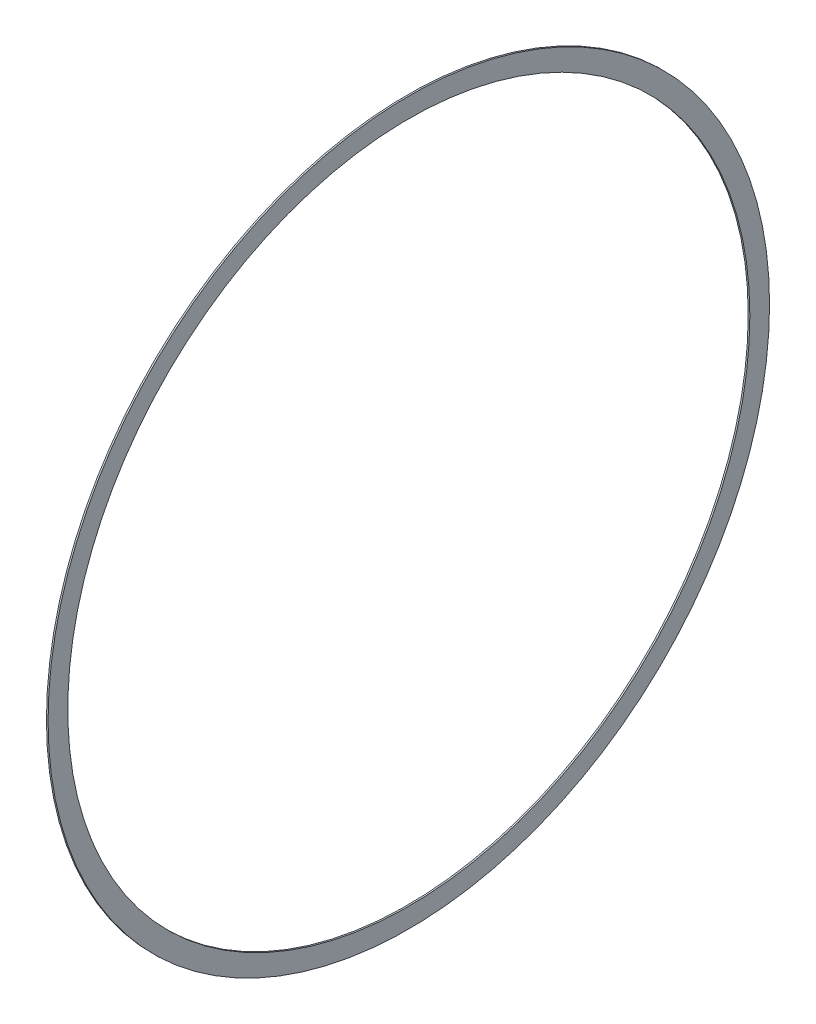
ISO-10303-21;
HEADER;
FILE_DESCRIPTION(('STEP AP214'),'2;1');
FILE_NAME('part.step','',(''),(''),'','','');
FILE_SCHEMA(('AUTOMOTIVE_DESIGN { 1 0 10303 214 1 1 1 1 }'));
ENDSEC;
DATA;
#1=APPLICATION_CONTEXT('core data for automotive mechanical design processes');
#2=APPLICATION_PROTOCOL_DEFINITION('international standard','automotive_design',2000,#1);
#3=PRODUCT_CONTEXT('',#1,'mechanical');
#4=PRODUCT('Part','Part','',(#3));
#5=PRODUCT_RELATED_PRODUCT_CATEGORY('part','',(#4));
#6=PRODUCT_DEFINITION_FORMATION('','',#4);
#7=PRODUCT_DEFINITION_CONTEXT('part definition',#1,'design');
#8=PRODUCT_DEFINITION('design','',#6,#7);
#9=PRODUCT_DEFINITION_SHAPE('','',#8);
#10=(LENGTH_UNIT() NAMED_UNIT(*) SI_UNIT(.MILLI.,.METRE.));
#11=(NAMED_UNIT(*) PLANE_ANGLE_UNIT() SI_UNIT($,.RADIAN.));
#12=(NAMED_UNIT(*) SI_UNIT($,.STERADIAN.) SOLID_ANGLE_UNIT());
#13=UNCERTAINTY_MEASURE_WITH_UNIT(LENGTH_MEASURE(1.E-05),#10,'distance_accuracy_value','');
#14=(GEOMETRIC_REPRESENTATION_CONTEXT(3) GLOBAL_UNCERTAINTY_ASSIGNED_CONTEXT((#13)) GLOBAL_UNIT_ASSIGNED_CONTEXT((#10,
#11,#12)) REPRESENTATION_CONTEXT('',''));
#15=CARTESIAN_POINT('',(0.,0.,0.));
#16=DIRECTION('',(0.,0.,1.));
#17=DIRECTION('',(1.,0.,0.));
#18=AXIS2_PLACEMENT_3D('',#15,#16,#17);
#19=CARTESIAN_POINT('',(5.,0.,0.));
#20=DIRECTION('',(1.,0.,0.));
#21=DIRECTION('',(0.,0.,-1.));
#22=AXIS2_PLACEMENT_3D('',#19,#20,#21);
#23=PLANE('',#22);
#24=CARTESIAN_POINT('',(5.,0.,0.));
#25=DIRECTION('',(1.,0.,0.));
#26=DIRECTION('',(0.,0.,-1.));
#27=AXIS2_PLACEMENT_3D('',#24,#25,#26);
#28=CIRCLE('',#27,1116.);
#29=CARTESIAN_POINT('',(5.,0.,-1116.));
#30=VERTEX_POINT('',#29);
#31=EDGE_CURVE('E10',#30,#30,#28,.T.);
#32=ORIENTED_EDGE('',*,*,#31,.T.);
#33=EDGE_LOOP('',(#32));
#34=FACE_BOUND('',#33,.T.);
#35=CARTESIAN_POINT('',(5.,0.,0.));
#36=DIRECTION('',(1.,0.,0.));
#37=DIRECTION('',(0.,0.,-1.));
#38=AXIS2_PLACEMENT_3D('',#35,#36,#37);
#39=CIRCLE('',#38,1055.);
#40=CARTESIAN_POINT('',(5.,0.,-1055.));
#41=VERTEX_POINT('',#40);
#42=EDGE_CURVE('E41',#41,#41,#39,.T.);
#43=ORIENTED_EDGE('',*,*,#42,.F.);
#44=EDGE_LOOP('',(#43));
#45=FACE_BOUND('',#44,.T.);
#46=ADVANCED_FACE('F30',(#34,#45),#23,.T.);
#47=CARTESIAN_POINT('',(0.,0.,0.));
#48=DIRECTION('',(1.,0.,0.));
#49=DIRECTION('',(0.,0.,-1.));
#50=AXIS2_PLACEMENT_3D('',#47,#48,#49);
#51=PLANE('',#50);
#52=CARTESIAN_POINT('',(0.,0.,0.));
#53=DIRECTION('',(1.,0.,0.));
#54=DIRECTION('',(0.,0.,-1.));
#55=AXIS2_PLACEMENT_3D('',#52,#53,#54);
#56=CIRCLE('',#55,1116.);
#57=CARTESIAN_POINT('',(0.,0.,-1116.));
#58=VERTEX_POINT('',#57);
#59=EDGE_CURVE('E34',#58,#58,#56,.T.);
#60=ORIENTED_EDGE('',*,*,#59,.F.);
#61=EDGE_LOOP('',(#60));
#62=FACE_BOUND('',#61,.T.);
#63=CARTESIAN_POINT('',(0.,0.,0.));
#64=DIRECTION('',(1.,0.,0.));
#65=DIRECTION('',(0.,0.,-1.));
#66=AXIS2_PLACEMENT_3D('',#63,#64,#65);
#67=CIRCLE('',#66,1055.);
#68=CARTESIAN_POINT('',(0.,0.,-1055.));
#69=VERTEX_POINT('',#68);
#70=EDGE_CURVE('E43',#69,#69,#67,.T.);
#71=ORIENTED_EDGE('',*,*,#70,.T.);
#72=EDGE_LOOP('',(#71));
#73=FACE_BOUND('',#72,.T.);
#74=ADVANCED_FACE('F53',(#62,#73),#51,.F.);
#75=CARTESIAN_POINT('',(5.,0.,0.));
#76=DIRECTION('',(-1.,0.,0.));
#77=DIRECTION('',(0.,0.,1.));
#78=AXIS2_PLACEMENT_3D('',#75,#76,#77);
#79=CYLINDRICAL_SURFACE('',#78,1116.);
#80=ORIENTED_EDGE('',*,*,#31,.F.);
#81=EDGE_LOOP('',(#80));
#82=FACE_BOUND('',#81,.T.);
#83=ORIENTED_EDGE('',*,*,#59,.T.);
#84=EDGE_LOOP('',(#83));
#85=FACE_BOUND('',#84,.T.);
#86=ADVANCED_FACE('F32',(#82,#85),#79,.T.);
#87=CARTESIAN_POINT('',(5.,0.,0.));
#88=DIRECTION('',(-1.,0.,0.));
#89=DIRECTION('',(0.,0.,1.));
#90=AXIS2_PLACEMENT_3D('',#87,#88,#89);
#91=CYLINDRICAL_SURFACE('',#90,1055.);
#92=ORIENTED_EDGE('',*,*,#42,.T.);
#93=EDGE_LOOP('',(#92));
#94=FACE_BOUND('',#93,.T.);
#95=ORIENTED_EDGE('',*,*,#70,.F.);
#96=EDGE_LOOP('',(#95));
#97=FACE_BOUND('',#96,.T.);
#98=ADVANCED_FACE('F49',(#94,#97),#91,.F.);
#99=CLOSED_SHELL('',(#46,#74,#86,#98));
#100=MANIFOLD_SOLID_BREP('B2',#99);
#101=ADVANCED_BREP_SHAPE_REPRESENTATION('',(#18,#100),#14);
#102=SHAPE_DEFINITION_REPRESENTATION(#9,#101);
ENDSEC;
END-ISO-10303-21;
